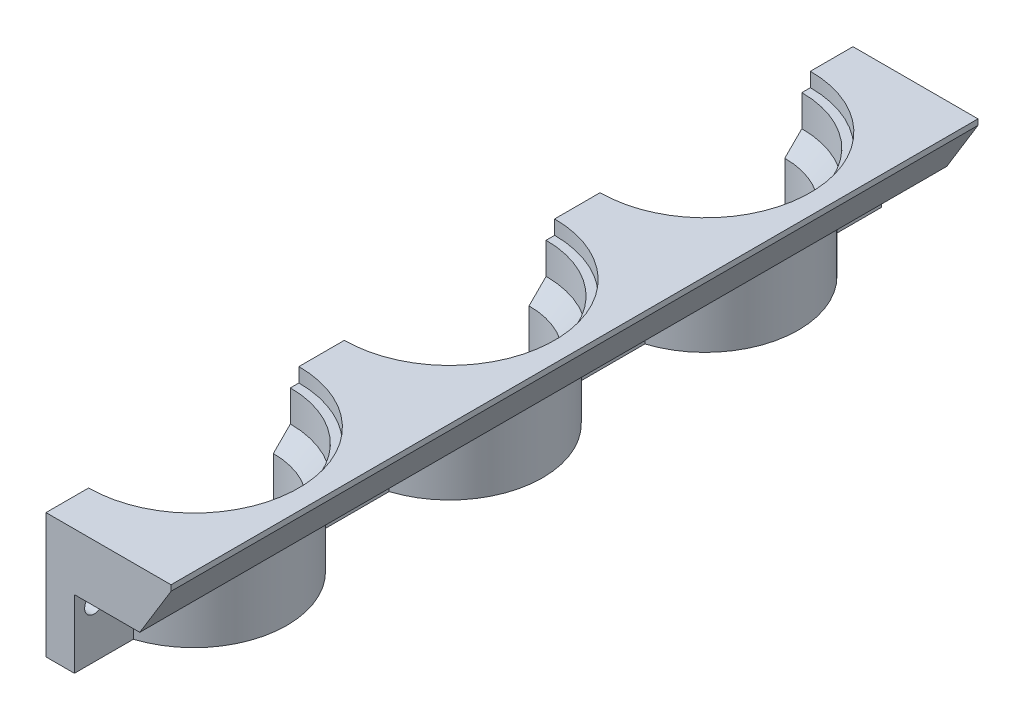
ISO-10303-21;
HEADER;
FILE_DESCRIPTION(('STEP AP214'),'2;1');
FILE_NAME('part.step','',(''),(''),'','','');
FILE_SCHEMA(('AUTOMOTIVE_DESIGN { 1 0 10303 214 1 1 1 1 }'));
ENDSEC;
DATA;
#1=APPLICATION_CONTEXT('core data for automotive mechanical design processes');
#2=APPLICATION_PROTOCOL_DEFINITION('international standard','automotive_design',2000,#1);
#3=PRODUCT_CONTEXT('',#1,'mechanical');
#4=PRODUCT('Part','Part','',(#3));
#5=PRODUCT_RELATED_PRODUCT_CATEGORY('part','',(#4));
#6=PRODUCT_DEFINITION_FORMATION('','',#4);
#7=PRODUCT_DEFINITION_CONTEXT('part definition',#1,'design');
#8=PRODUCT_DEFINITION('design','',#6,#7);
#9=PRODUCT_DEFINITION_SHAPE('','',#8);
#10=(LENGTH_UNIT() NAMED_UNIT(*) SI_UNIT(.MILLI.,.METRE.));
#11=(NAMED_UNIT(*) PLANE_ANGLE_UNIT() SI_UNIT($,.RADIAN.));
#12=(NAMED_UNIT(*) SI_UNIT($,.STERADIAN.) SOLID_ANGLE_UNIT());
#13=UNCERTAINTY_MEASURE_WITH_UNIT(LENGTH_MEASURE(1.E-05),#10,'distance_accuracy_value','');
#14=(GEOMETRIC_REPRESENTATION_CONTEXT(3) GLOBAL_UNCERTAINTY_ASSIGNED_CONTEXT((#13)) GLOBAL_UNIT_ASSIGNED_CONTEXT((#10,
#11,#12)) REPRESENTATION_CONTEXT('',''));
#15=CARTESIAN_POINT('',(0.,0.,0.));
#16=DIRECTION('',(0.,0.,1.));
#17=DIRECTION('',(1.,0.,0.));
#18=AXIS2_PLACEMENT_3D('',#15,#16,#17);
#19=CARTESIAN_POINT('',(0.,-10.,0.));
#20=DIRECTION('',(0.,1.,0.));
#21=DIRECTION('',(0.,0.,1.));
#22=AXIS2_PLACEMENT_3D('',#19,#20,#21);
#23=PLANE('',#22);
#24=DIRECTION('',(-1.,0.,0.));
#25=VECTOR('',#24,1.);
#26=CARTESIAN_POINT('',(0.,-10.,-116.));
#27=LINE('',#26,#25);
#28=CARTESIAN_POINT('',(16.5,-10.,-116.));
#29=VERTEX_POINT('',#28);
#30=CARTESIAN_POINT('',(5.00000000000001,-10.,-116.));
#31=VERTEX_POINT('',#30);
#32=EDGE_CURVE('E336',#29,#31,#27,.T.);
#33=ORIENTED_EDGE('',*,*,#32,.F.);
#34=DIRECTION('',(0.,0.,1.));
#35=VECTOR('',#34,1.);
#36=CARTESIAN_POINT('',(16.5,-10.,26.));
#37=LINE('',#36,#35);
#38=CARTESIAN_POINT('',(16.5,-10.,26.));
#39=VERTEX_POINT('',#38);
#40=EDGE_CURVE('E320',#29,#39,#37,.T.);
#41=ORIENTED_EDGE('',*,*,#40,.T.);
#42=DIRECTION('',(1.,0.,0.));
#43=VECTOR('',#42,1.);
#44=CARTESIAN_POINT('',(0.,-10.,26.));
#45=LINE('',#44,#43);
#46=CARTESIAN_POINT('',(5.00000000000001,-10.,26.));
#47=VERTEX_POINT('',#46);
#48=EDGE_CURVE('E348',#47,#39,#45,.T.);
#49=ORIENTED_EDGE('',*,*,#48,.F.);
#50=DIRECTION('',(0.,0.,1.));
#51=VECTOR('',#50,1.);
#52=CARTESIAN_POINT('',(5.,-10.,15.6192189305355));
#53=LINE('',#52,#51);
#54=CARTESIAN_POINT('',(5.,-10.,15.6192189305355));
#55=VERTEX_POINT('',#54);
#56=EDGE_CURVE('E410',#55,#47,#53,.T.);
#57=ORIENTED_EDGE('',*,*,#56,.F.);
#58=CARTESIAN_POINT('',(0.,-10.,0.));
#59=DIRECTION('',(0.,-1.,0.));
#60=DIRECTION('',(0.,0.,-1.));
#61=AXIS2_PLACEMENT_3D('',#58,#59,#60);
#62=CIRCLE('',#61,16.4);
#63=CARTESIAN_POINT('',(5.,-10.,-15.6192189305355));
#64=VERTEX_POINT('',#63);
#65=EDGE_CURVE('E415',#64,#55,#62,.T.);
#66=ORIENTED_EDGE('',*,*,#65,.F.);
#67=DIRECTION('',(0.,0.,1.));
#68=VECTOR('',#67,1.);
#69=CARTESIAN_POINT('',(5.,-10.,-29.3807810694645));
#70=LINE('',#69,#68);
#71=CARTESIAN_POINT('',(5.,-10.,-29.3807810694645));
#72=VERTEX_POINT('',#71);
#73=EDGE_CURVE('E419',#72,#64,#70,.T.);
#74=ORIENTED_EDGE('',*,*,#73,.F.);
#75=CARTESIAN_POINT('',(0.,-10.,-45.));
#76=DIRECTION('',(0.,-1.,0.));
#77=DIRECTION('',(0.,0.,-1.));
#78=AXIS2_PLACEMENT_3D('',#75,#76,#77);
#79=CIRCLE('',#78,16.4);
#80=CARTESIAN_POINT('',(5.,-10.,-60.6192189305355));
#81=VERTEX_POINT('',#80);
#82=EDGE_CURVE('E423',#81,#72,#79,.T.);
#83=ORIENTED_EDGE('',*,*,#82,.F.);
#84=DIRECTION('',(0.,0.,1.));
#85=VECTOR('',#84,1.);
#86=CARTESIAN_POINT('',(5.,-10.,-74.3807810694645));
#87=LINE('',#86,#85);
#88=CARTESIAN_POINT('',(5.,-10.,-74.3807810694645));
#89=VERTEX_POINT('',#88);
#90=EDGE_CURVE('E427',#89,#81,#87,.T.);
#91=ORIENTED_EDGE('',*,*,#90,.F.);
#92=CARTESIAN_POINT('',(0.,-10.,-90.));
#93=DIRECTION('',(0.,-1.,0.));
#94=DIRECTION('',(0.,0.,-1.));
#95=AXIS2_PLACEMENT_3D('',#92,#93,#94);
#96=CIRCLE('',#95,16.4);
#97=CARTESIAN_POINT('',(5.,-10.,-105.619218930536));
#98=VERTEX_POINT('',#97);
#99=EDGE_CURVE('E431',#98,#89,#96,.T.);
#100=ORIENTED_EDGE('',*,*,#99,.F.);
#101=DIRECTION('',(0.,0.,1.));
#102=VECTOR('',#101,1.);
#103=CARTESIAN_POINT('',(5.00000000000001,-10.,-116.));
#104=LINE('',#103,#102);
#105=EDGE_CURVE('E435',#31,#98,#104,.T.);
#106=ORIENTED_EDGE('',*,*,#105,.F.);
#107=EDGE_LOOP('',(#33,#41,#49,#57,#66,#74,#83,#91,#100,#106));
#108=FACE_BOUND('',#107,.T.);
#109=ADVANCED_FACE('F49',(#108),#23,.F.);
#110=CARTESIAN_POINT('',(0.,-10.,-11.4));
#111=DIRECTION('',(-1.,0.,0.));
#112=DIRECTION('',(0.,0.,1.));
#113=AXIS2_PLACEMENT_3D('',#110,#111,#112);
#114=PLANE('',#113);
#115=CARTESIAN_POINT('',(0.,-13.,-22.5));
#116=DIRECTION('',(-1.,0.,0.));
#117=DIRECTION('',(0.,0.,1.));
#118=AXIS2_PLACEMENT_3D('',#115,#116,#117);
#119=CIRCLE('',#118,1.7);
#120=CARTESIAN_POINT('',(0.,-13.,-20.8));
#121=VERTEX_POINT('',#120);
#122=EDGE_CURVE('E593',#121,#121,#119,.T.);
#123=ORIENTED_EDGE('',*,*,#122,.F.);
#124=EDGE_LOOP('',(#123));
#125=FACE_BOUND('',#124,.T.);
#126=DIRECTION('',(0.,1.,0.));
#127=VECTOR('',#126,1.);
#128=CARTESIAN_POINT('',(0.,0.,-14.));
#129=LINE('',#128,#127);
#130=CARTESIAN_POINT('',(0.,-11.,-14.));
#131=VERTEX_POINT('',#130);
#132=CARTESIAN_POINT('',(0.,-22.,-14.));
#133=VERTEX_POINT('',#132);
#134=EDGE_CURVE('E66',#131,#133,#129,.F.);
#135=ORIENTED_EDGE('',*,*,#134,.F.);
#136=DIRECTION('',(0.,-0.707106781186549,0.707106781186546));
#137=VECTOR('',#136,1.);
#138=CARTESIAN_POINT('',(0.,-25.,0.));
#139=LINE('',#138,#137);
#140=CARTESIAN_POINT('',(0.,-8.,-17.));
#141=VERTEX_POINT('',#140);
#142=EDGE_CURVE('E271',#141,#131,#139,.T.);
#143=ORIENTED_EDGE('',*,*,#142,.F.);
#144=DIRECTION('',(0.,1.,0.));
#145=VECTOR('',#144,1.);
#146=CARTESIAN_POINT('',(0.,0.,-17.));
#147=LINE('',#146,#145);
#148=CARTESIAN_POINT('',(0.,-2.5,-17.));
#149=VERTEX_POINT('',#148);
#150=EDGE_CURVE('E549',#149,#141,#147,.F.);
#151=ORIENTED_EDGE('',*,*,#150,.F.);
#152=DIRECTION('',(0.,0.,-1.));
#153=VECTOR('',#152,1.);
#154=CARTESIAN_POINT('',(0.,-2.5,-11.4));
#155=LINE('',#154,#153);
#156=CARTESIAN_POINT('',(0.,-2.5,-18.5));
#157=VERTEX_POINT('',#156);
#158=EDGE_CURVE('E563',#149,#157,#155,.T.);
#159=ORIENTED_EDGE('',*,*,#158,.T.);
#160=DIRECTION('',(0.,1.,0.));
#161=VECTOR('',#160,1.);
#162=CARTESIAN_POINT('',(0.,0.,-18.5));
#163=LINE('',#162,#161);
#164=CARTESIAN_POINT('',(0.,0.,-18.5));
#165=VERTEX_POINT('',#164);
#166=EDGE_CURVE('E567',#165,#157,#163,.F.);
#167=ORIENTED_EDGE('',*,*,#166,.F.);
#168=DIRECTION('',(0.,0.,1.));
#169=VECTOR('',#168,1.);
#170=CARTESIAN_POINT('',(0.,0.,-11.4));
#171=LINE('',#170,#169);
#172=CARTESIAN_POINT('',(0.,0.,-26.5));
#173=VERTEX_POINT('',#172);
#174=EDGE_CURVE('E344',#173,#165,#171,.T.);
#175=ORIENTED_EDGE('',*,*,#174,.F.);
#176=DIRECTION('',(0.,1.,0.));
#177=VECTOR('',#176,1.);
#178=CARTESIAN_POINT('',(0.,0.,-26.5));
#179=LINE('',#178,#177);
#180=CARTESIAN_POINT('',(0.,-2.5,-26.5));
#181=VERTEX_POINT('',#180);
#182=EDGE_CURVE('E529',#181,#173,#179,.T.);
#183=ORIENTED_EDGE('',*,*,#182,.F.);
#184=DIRECTION('',(0.,0.,-1.));
#185=VECTOR('',#184,1.);
#186=CARTESIAN_POINT('',(0.,-2.5,-11.4));
#187=LINE('',#186,#185);
#188=CARTESIAN_POINT('',(0.,-2.5,-28.));
#189=VERTEX_POINT('',#188);
#190=EDGE_CURVE('E525',#181,#189,#187,.T.);
#191=ORIENTED_EDGE('',*,*,#190,.T.);
#192=DIRECTION('',(0.,1.,0.));
#193=VECTOR('',#192,1.);
#194=CARTESIAN_POINT('',(0.,0.,-28.));
#195=LINE('',#194,#193);
#196=CARTESIAN_POINT('',(0.,-8.,-28.));
#197=VERTEX_POINT('',#196);
#198=EDGE_CURVE('E509',#197,#189,#195,.T.);
#199=ORIENTED_EDGE('',*,*,#198,.F.);
#200=DIRECTION('',(0.,0.707106781186549,0.707106781186546));
#201=VECTOR('',#200,1.);
#202=CARTESIAN_POINT('',(0.,-25.,-45.));
#203=LINE('',#202,#201);
#204=CARTESIAN_POINT('',(0.,-11.,-31.));
#205=VERTEX_POINT('',#204);
#206=EDGE_CURVE('E522',#205,#197,#203,.T.);
#207=ORIENTED_EDGE('',*,*,#206,.F.);
#208=DIRECTION('',(0.,1.,0.));
#209=VECTOR('',#208,1.);
#210=CARTESIAN_POINT('',(0.,0.,-31.));
#211=LINE('',#210,#209);
#212=CARTESIAN_POINT('',(0.,-22.,-31.));
#213=VERTEX_POINT('',#212);
#214=EDGE_CURVE('E535',#213,#205,#211,.T.);
#215=ORIENTED_EDGE('',*,*,#214,.F.);
#216=DIRECTION('',(0.,0.,-1.));
#217=VECTOR('',#216,1.);
#218=CARTESIAN_POINT('',(0.,-22.,-33.6));
#219=LINE('',#218,#217);
#220=EDGE_CURVE('E445',#133,#213,#219,.T.);
#221=ORIENTED_EDGE('',*,*,#220,.F.);
#222=EDGE_LOOP('',(#135,#143,#151,#159,#167,#175,#183,#191,#199,#207,#215,#221));
#223=FACE_BOUND('',#222,.T.);
#224=ADVANCED_FACE('F690',(#125,#223),#114,.T.);
#225=CARTESIAN_POINT('',(0.,-10.,-56.4));
#226=DIRECTION('',(-1.,0.,0.));
#227=DIRECTION('',(0.,0.,1.));
#228=AXIS2_PLACEMENT_3D('',#225,#226,#227);
#229=PLANE('',#228);
#230=CARTESIAN_POINT('',(0.,-13.,-67.5));
#231=DIRECTION('',(-1.,0.,0.));
#232=DIRECTION('',(0.,0.,1.));
#233=AXIS2_PLACEMENT_3D('',#230,#231,#232);
#234=CIRCLE('',#233,1.7);
#235=CARTESIAN_POINT('',(0.,-13.,-65.8));
#236=VERTEX_POINT('',#235);
#237=EDGE_CURVE('E581',#236,#236,#234,.T.);
#238=ORIENTED_EDGE('',*,*,#237,.F.);
#239=EDGE_LOOP('',(#238));
#240=FACE_BOUND('',#239,.T.);
#241=DIRECTION('',(0.,1.,0.));
#242=VECTOR('',#241,1.);
#243=CARTESIAN_POINT('',(0.,0.,-59.));
#244=LINE('',#243,#242);
#245=CARTESIAN_POINT('',(0.,-11.,-59.));
#246=VERTEX_POINT('',#245);
#247=CARTESIAN_POINT('',(0.,-22.,-59.));
#248=VERTEX_POINT('',#247);
#249=EDGE_CURVE('E74',#246,#248,#244,.F.);
#250=ORIENTED_EDGE('',*,*,#249,.F.);
#251=DIRECTION('',(0.,-0.707106781186549,0.707106781186546));
#252=VECTOR('',#251,1.);
#253=CARTESIAN_POINT('',(0.,-25.,-45.));
#254=LINE('',#253,#252);
#255=CARTESIAN_POINT('',(0.,-8.,-62.));
#256=VERTEX_POINT('',#255);
#257=EDGE_CURVE('E290',#256,#246,#254,.T.);
#258=ORIENTED_EDGE('',*,*,#257,.F.);
#259=DIRECTION('',(0.,1.,0.));
#260=VECTOR('',#259,1.);
#261=CARTESIAN_POINT('',(0.,0.,-62.));
#262=LINE('',#261,#260);
#263=CARTESIAN_POINT('',(0.,-2.5,-62.));
#264=VERTEX_POINT('',#263);
#265=EDGE_CURVE('E293',#264,#256,#262,.F.);
#266=ORIENTED_EDGE('',*,*,#265,.F.);
#267=DIRECTION('',(0.,0.,-1.));
#268=VECTOR('',#267,1.);
#269=CARTESIAN_POINT('',(0.,-2.5,-56.4));
#270=LINE('',#269,#268);
#271=CARTESIAN_POINT('',(0.,-2.5,-63.5));
#272=VERTEX_POINT('',#271);
#273=EDGE_CURVE('E296',#264,#272,#270,.T.);
#274=ORIENTED_EDGE('',*,*,#273,.T.);
#275=DIRECTION('',(0.,1.,0.));
#276=VECTOR('',#275,1.);
#277=CARTESIAN_POINT('',(0.,0.,-63.5));
#278=LINE('',#277,#276);
#279=CARTESIAN_POINT('',(0.,0.,-63.5));
#280=VERTEX_POINT('',#279);
#281=EDGE_CURVE('E532',#280,#272,#278,.F.);
#282=ORIENTED_EDGE('',*,*,#281,.F.);
#283=DIRECTION('',(0.,0.,1.));
#284=VECTOR('',#283,1.);
#285=CARTESIAN_POINT('',(0.,0.,-56.4));
#286=LINE('',#285,#284);
#287=CARTESIAN_POINT('',(0.,0.,-71.5));
#288=VERTEX_POINT('',#287);
#289=EDGE_CURVE('E349',#288,#280,#286,.T.);
#290=ORIENTED_EDGE('',*,*,#289,.F.);
#291=DIRECTION('',(0.,1.,0.));
#292=VECTOR('',#291,1.);
#293=CARTESIAN_POINT('',(0.,0.,-71.5));
#294=LINE('',#293,#292);
#295=CARTESIAN_POINT('',(0.,-2.5,-71.5));
#296=VERTEX_POINT('',#295);
#297=EDGE_CURVE('E488',#296,#288,#294,.T.);
#298=ORIENTED_EDGE('',*,*,#297,.F.);
#299=DIRECTION('',(0.,0.,-1.));
#300=VECTOR('',#299,1.);
#301=CARTESIAN_POINT('',(0.,-2.5,-56.4));
#302=LINE('',#301,#300);
#303=CARTESIAN_POINT('',(0.,-2.5,-73.));
#304=VERTEX_POINT('',#303);
#305=EDGE_CURVE('E484',#296,#304,#302,.T.);
#306=ORIENTED_EDGE('',*,*,#305,.T.);
#307=DIRECTION('',(0.,1.,0.));
#308=VECTOR('',#307,1.);
#309=CARTESIAN_POINT('',(0.,0.,-73.));
#310=LINE('',#309,#308);
#311=CARTESIAN_POINT('',(0.,-8.,-73.));
#312=VERTEX_POINT('',#311);
#313=EDGE_CURVE('E439',#312,#304,#310,.T.);
#314=ORIENTED_EDGE('',*,*,#313,.F.);
#315=DIRECTION('',(0.,0.707106781186549,0.707106781186546));
#316=VECTOR('',#315,1.);
#317=CARTESIAN_POINT('',(0.,-25.,-90.));
#318=LINE('',#317,#316);
#319=CARTESIAN_POINT('',(0.,-11.,-76.));
#320=VERTEX_POINT('',#319);
#321=EDGE_CURVE('E481',#320,#312,#318,.T.);
#322=ORIENTED_EDGE('',*,*,#321,.F.);
#323=DIRECTION('',(0.,1.,0.));
#324=VECTOR('',#323,1.);
#325=CARTESIAN_POINT('',(0.,0.,-76.));
#326=LINE('',#325,#324);
#327=CARTESIAN_POINT('',(0.,-22.,-76.));
#328=VERTEX_POINT('',#327);
#329=EDGE_CURVE('E494',#328,#320,#326,.T.);
#330=ORIENTED_EDGE('',*,*,#329,.F.);
#331=DIRECTION('',(0.,0.,-1.));
#332=VECTOR('',#331,1.);
#333=CARTESIAN_POINT('',(0.,-22.,-78.6));
#334=LINE('',#333,#332);
#335=EDGE_CURVE('E442',#248,#328,#334,.T.);
#336=ORIENTED_EDGE('',*,*,#335,.F.);
#337=EDGE_LOOP('',(#250,#258,#266,#274,#282,#290,#298,#306,#314,#322,#330,#336));
#338=FACE_BOUND('',#337,.T.);
#339=ADVANCED_FACE('F695',(#240,#338),#229,.T.);
#340=CARTESIAN_POINT('',(0.,-10.,-101.4));
#341=DIRECTION('',(-1.,0.,0.));
#342=DIRECTION('',(0.,0.,1.));
#343=AXIS2_PLACEMENT_3D('',#340,#341,#342);
#344=PLANE('',#343);
#345=CARTESIAN_POINT('',(0.,-13.,-112.5));
#346=DIRECTION('',(-1.,0.,0.));
#347=DIRECTION('',(0.,0.,1.));
#348=AXIS2_PLACEMENT_3D('',#345,#346,#347);
#349=CIRCLE('',#348,1.7);
#350=CARTESIAN_POINT('',(0.,-13.,-110.8));
#351=VERTEX_POINT('',#350);
#352=EDGE_CURVE('E606',#351,#351,#349,.T.);
#353=ORIENTED_EDGE('',*,*,#352,.F.);
#354=EDGE_LOOP('',(#353));
#355=FACE_BOUND('',#354,.T.);
#356=DIRECTION('',(0.,1.,0.));
#357=VECTOR('',#356,1.);
#358=CARTESIAN_POINT('',(0.,0.,-104.));
#359=LINE('',#358,#357);
#360=CARTESIAN_POINT('',(0.,-11.,-104.));
#361=VERTEX_POINT('',#360);
#362=CARTESIAN_POINT('',(0.,-22.,-104.));
#363=VERTEX_POINT('',#362);
#364=EDGE_CURVE('E497',#361,#363,#359,.F.);
#365=ORIENTED_EDGE('',*,*,#364,.F.);
#366=DIRECTION('',(0.,-0.707106781186549,0.707106781186546));
#367=VECTOR('',#366,1.);
#368=CARTESIAN_POINT('',(0.,-25.,-90.));
#369=LINE('',#368,#367);
#370=CARTESIAN_POINT('',(0.,-8.,-107.));
#371=VERTEX_POINT('',#370);
#372=EDGE_CURVE('E303',#371,#361,#369,.T.);
#373=ORIENTED_EDGE('',*,*,#372,.F.);
#374=DIRECTION('',(0.,1.,0.));
#375=VECTOR('',#374,1.);
#376=CARTESIAN_POINT('',(0.,0.,-107.));
#377=LINE('',#376,#375);
#378=CARTESIAN_POINT('',(0.,-2.5,-107.));
#379=VERTEX_POINT('',#378);
#380=EDGE_CURVE('E306',#379,#371,#377,.F.);
#381=ORIENTED_EDGE('',*,*,#380,.F.);
#382=DIRECTION('',(0.,0.,-1.));
#383=VECTOR('',#382,1.);
#384=CARTESIAN_POINT('',(0.,-2.5,-101.4));
#385=LINE('',#384,#383);
#386=CARTESIAN_POINT('',(0.,-2.5,-108.5));
#387=VERTEX_POINT('',#386);
#388=EDGE_CURVE('E309',#379,#387,#385,.T.);
#389=ORIENTED_EDGE('',*,*,#388,.T.);
#390=DIRECTION('',(0.,1.,0.));
#391=VECTOR('',#390,1.);
#392=CARTESIAN_POINT('',(0.,0.,-108.5));
#393=LINE('',#392,#391);
#394=CARTESIAN_POINT('',(0.,0.,-108.5));
#395=VERTEX_POINT('',#394);
#396=EDGE_CURVE('E491',#395,#387,#393,.F.);
#397=ORIENTED_EDGE('',*,*,#396,.F.);
#398=DIRECTION('',(0.,0.,1.));
#399=VECTOR('',#398,1.);
#400=CARTESIAN_POINT('',(0.,0.,-101.4));
#401=LINE('',#400,#399);
#402=CARTESIAN_POINT('',(0.,0.,-116.));
#403=VERTEX_POINT('',#402);
#404=EDGE_CURVE('E353',#403,#395,#401,.T.);
#405=ORIENTED_EDGE('',*,*,#404,.F.);
#406=DIRECTION('',(0.,1.,0.));
#407=VECTOR('',#406,1.);
#408=CARTESIAN_POINT('',(0.,-10.,-116.));
#409=LINE('',#408,#407);
#410=CARTESIAN_POINT('',(0.,-22.,-116.));
#411=VERTEX_POINT('',#410);
#412=EDGE_CURVE('E330',#411,#403,#409,.T.);
#413=ORIENTED_EDGE('',*,*,#412,.F.);
#414=DIRECTION('',(0.,0.,-1.));
#415=VECTOR('',#414,1.);
#416=CARTESIAN_POINT('',(0.,-22.,-116.));
#417=LINE('',#416,#415);
#418=EDGE_CURVE('E409',#363,#411,#417,.T.);
#419=ORIENTED_EDGE('',*,*,#418,.F.);
#420=EDGE_LOOP('',(#365,#373,#381,#389,#397,#405,#413,#419));
#421=FACE_BOUND('',#420,.T.);
#422=ADVANCED_FACE('F703',(#355,#421),#344,.T.);
#423=CARTESIAN_POINT('',(0.,-10.,-116.));
#424=DIRECTION('',(0.,0.,-1.));
#425=DIRECTION('',(-1.,0.,0.));
#426=AXIS2_PLACEMENT_3D('',#423,#424,#425);
#427=PLANE('',#426);
#428=DIRECTION('',(0.,1.,0.));
#429=VECTOR('',#428,1.);
#430=CARTESIAN_POINT('',(22.,-10.,-116.));
#431=LINE('',#430,#429);
#432=CARTESIAN_POINT('',(22.,-0.999999999999964,-116.));
#433=VERTEX_POINT('',#432);
#434=CARTESIAN_POINT('',(22.,0.,-116.));
#435=VERTEX_POINT('',#434);
#436=EDGE_CURVE('E339',#433,#435,#431,.T.);
#437=ORIENTED_EDGE('',*,*,#436,.F.);
#438=DIRECTION('',(-0.521450009453974,-0.85328183365196,0.));
#439=VECTOR('',#438,1.);
#440=CARTESIAN_POINT('',(12.0134831460674,-17.3415730337079,-116.));
#441=LINE('',#440,#439);
#442=EDGE_CURVE('E323',#433,#29,#441,.T.);
#443=ORIENTED_EDGE('',*,*,#442,.T.);
#444=ORIENTED_EDGE('',*,*,#32,.T.);
#445=DIRECTION('',(0.,1.,0.));
#446=VECTOR('',#445,1.);
#447=CARTESIAN_POINT('',(5.00000000000001,-22.,-116.));
#448=LINE('',#447,#446);
#449=CARTESIAN_POINT('',(5.00000000000001,-22.,-116.));
#450=VERTEX_POINT('',#449);
#451=EDGE_CURVE('E372',#450,#31,#448,.T.);
#452=ORIENTED_EDGE('',*,*,#451,.F.);
#453=DIRECTION('',(1.,0.,0.));
#454=VECTOR('',#453,1.);
#455=CARTESIAN_POINT('',(0.,-22.,-116.));
#456=LINE('',#455,#454);
#457=EDGE_CURVE('E414',#411,#450,#456,.T.);
#458=ORIENTED_EDGE('',*,*,#457,.F.);
#459=ORIENTED_EDGE('',*,*,#412,.T.);
#460=DIRECTION('',(-1.,0.,0.));
#461=VECTOR('',#460,1.);
#462=CARTESIAN_POINT('',(0.,0.,-116.));
#463=LINE('',#462,#461);
#464=EDGE_CURVE('E357',#435,#403,#463,.T.);
#465=ORIENTED_EDGE('',*,*,#464,.F.);
#466=EDGE_LOOP('',(#437,#443,#444,#452,#458,#459,#465));
#467=FACE_BOUND('',#466,.T.);
#468=ADVANCED_FACE('F644',(#467),#427,.T.);
#469=CARTESIAN_POINT('',(22.,-10.,26.));
#470=DIRECTION('',(1.,0.,0.));
#471=DIRECTION('',(0.,0.,-1.));
#472=AXIS2_PLACEMENT_3D('',#469,#470,#471);
#473=PLANE('',#472);
#474=DIRECTION('',(0.,1.,0.));
#475=VECTOR('',#474,1.);
#476=CARTESIAN_POINT('',(22.,-10.,26.));
#477=LINE('',#476,#475);
#478=CARTESIAN_POINT('',(22.,-0.999999999999964,26.));
#479=VERTEX_POINT('',#478);
#480=CARTESIAN_POINT('',(22.,0.,26.));
#481=VERTEX_POINT('',#480);
#482=EDGE_CURVE('E335',#479,#481,#477,.T.);
#483=ORIENTED_EDGE('',*,*,#482,.F.);
#484=DIRECTION('',(0.,0.,-1.));
#485=VECTOR('',#484,1.);
#486=CARTESIAN_POINT('',(22.,-0.999999999999964,-116.));
#487=LINE('',#486,#485);
#488=EDGE_CURVE('E326',#479,#433,#487,.T.);
#489=ORIENTED_EDGE('',*,*,#488,.T.);
#490=ORIENTED_EDGE('',*,*,#436,.T.);
#491=DIRECTION('',(0.,0.,-1.));
#492=VECTOR('',#491,1.);
#493=CARTESIAN_POINT('',(22.,0.,26.));
#494=LINE('',#493,#492);
#495=EDGE_CURVE('E361',#481,#435,#494,.T.);
#496=ORIENTED_EDGE('',*,*,#495,.F.);
#497=EDGE_LOOP('',(#483,#489,#490,#496));
#498=FACE_BOUND('',#497,.T.);
#499=ADVANCED_FACE('F655',(#498),#473,.T.);
#500=CARTESIAN_POINT('',(0.,-10.,26.));
#501=DIRECTION('',(0.,0.,1.));
#502=DIRECTION('',(1.,0.,0.));
#503=AXIS2_PLACEMENT_3D('',#500,#501,#502);
#504=PLANE('',#503);
#505=ORIENTED_EDGE('',*,*,#48,.T.);
#506=DIRECTION('',(0.521450009453974,0.85328183365196,0.));
#507=VECTOR('',#506,1.);
#508=CARTESIAN_POINT('',(12.0134831460674,-17.3415730337079,26.));
#509=LINE('',#508,#507);
#510=EDGE_CURVE('E317',#39,#479,#509,.T.);
#511=ORIENTED_EDGE('',*,*,#510,.T.);
#512=ORIENTED_EDGE('',*,*,#482,.T.);
#513=DIRECTION('',(1.,0.,0.));
#514=VECTOR('',#513,1.);
#515=CARTESIAN_POINT('',(0.,0.,26.));
#516=LINE('',#515,#514);
#517=CARTESIAN_POINT('',(0.,0.,26.));
#518=VERTEX_POINT('',#517);
#519=EDGE_CURVE('E365',#518,#481,#516,.T.);
#520=ORIENTED_EDGE('',*,*,#519,.F.);
#521=DIRECTION('',(0.,1.,0.));
#522=VECTOR('',#521,1.);
#523=CARTESIAN_POINT('',(0.,-10.,26.));
#524=LINE('',#523,#522);
#525=CARTESIAN_POINT('',(0.,-22.,26.));
#526=VERTEX_POINT('',#525);
#527=EDGE_CURVE('E331',#526,#518,#524,.T.);
#528=ORIENTED_EDGE('',*,*,#527,.F.);
#529=DIRECTION('',(-1.,0.,0.));
#530=VECTOR('',#529,1.);
#531=CARTESIAN_POINT('',(0.,-22.,26.));
#532=LINE('',#531,#530);
#533=CARTESIAN_POINT('',(5.00000000000001,-22.,26.));
#534=VERTEX_POINT('',#533);
#535=EDGE_CURVE('E451',#534,#526,#532,.T.);
#536=ORIENTED_EDGE('',*,*,#535,.F.);
#537=DIRECTION('',(0.,1.,0.));
#538=VECTOR('',#537,1.);
#539=CARTESIAN_POINT('',(5.00000000000001,-22.,26.));
#540=LINE('',#539,#538);
#541=EDGE_CURVE('E405',#534,#47,#540,.T.);
#542=ORIENTED_EDGE('',*,*,#541,.T.);
#543=EDGE_LOOP('',(#505,#511,#512,#520,#528,#536,#542));
#544=FACE_BOUND('',#543,.T.);
#545=ADVANCED_FACE('F651',(#544),#504,.T.);
#546=CARTESIAN_POINT('',(0.,-10.,11.4));
#547=DIRECTION('',(-1.,0.,0.));
#548=DIRECTION('',(0.,0.,1.));
#549=AXIS2_PLACEMENT_3D('',#546,#547,#548);
#550=PLANE('',#549);
#551=CARTESIAN_POINT('',(0.,-13.,22.5));
#552=DIRECTION('',(-1.,0.,0.));
#553=DIRECTION('',(0.,0.,1.));
#554=AXIS2_PLACEMENT_3D('',#551,#552,#553);
#555=CIRCLE('',#554,1.7);
#556=CARTESIAN_POINT('',(0.,-13.,24.2));
#557=VERTEX_POINT('',#556);
#558=EDGE_CURVE('E597',#557,#557,#555,.T.);
#559=ORIENTED_EDGE('',*,*,#558,.F.);
#560=EDGE_LOOP('',(#559));
#561=FACE_BOUND('',#560,.T.);
#562=DIRECTION('',(0.,1.,0.));
#563=VECTOR('',#562,1.);
#564=CARTESIAN_POINT('',(0.,0.,14.));
#565=LINE('',#564,#563);
#566=CARTESIAN_POINT('',(0.,-22.,14.));
#567=VERTEX_POINT('',#566);
#568=CARTESIAN_POINT('',(0.,-11.,14.));
#569=VERTEX_POINT('',#568);
#570=EDGE_CURVE('E254',#567,#569,#565,.T.);
#571=ORIENTED_EDGE('',*,*,#570,.F.);
#572=DIRECTION('',(0.,0.,-1.));
#573=VECTOR('',#572,1.);
#574=CARTESIAN_POINT('',(0.,-22.,11.4));
#575=LINE('',#574,#573);
#576=EDGE_CURVE('E448',#526,#567,#575,.T.);
#577=ORIENTED_EDGE('',*,*,#576,.F.);
#578=ORIENTED_EDGE('',*,*,#527,.T.);
#579=DIRECTION('',(0.,0.,1.));
#580=VECTOR('',#579,1.);
#581=CARTESIAN_POINT('',(0.,0.,11.4));
#582=LINE('',#581,#580);
#583=CARTESIAN_POINT('',(0.,0.,18.5));
#584=VERTEX_POINT('',#583);
#585=EDGE_CURVE('E369',#584,#518,#582,.T.);
#586=ORIENTED_EDGE('',*,*,#585,.F.);
#587=DIRECTION('',(0.,1.,0.));
#588=VECTOR('',#587,1.);
#589=CARTESIAN_POINT('',(0.,0.,18.5));
#590=LINE('',#589,#588);
#591=CARTESIAN_POINT('',(0.,-2.5,18.5));
#592=VERTEX_POINT('',#591);
#593=EDGE_CURVE('E570',#592,#584,#590,.T.);
#594=ORIENTED_EDGE('',*,*,#593,.F.);
#595=DIRECTION('',(0.,0.,-1.));
#596=VECTOR('',#595,1.);
#597=CARTESIAN_POINT('',(0.,-2.5,11.4));
#598=LINE('',#597,#596);
#599=CARTESIAN_POINT('',(0.,-2.5,17.));
#600=VERTEX_POINT('',#599);
#601=EDGE_CURVE('E280',#592,#600,#598,.T.);
#602=ORIENTED_EDGE('',*,*,#601,.T.);
#603=DIRECTION('',(0.,1.,0.));
#604=VECTOR('',#603,1.);
#605=CARTESIAN_POINT('',(0.,0.,17.));
#606=LINE('',#605,#604);
#607=CARTESIAN_POINT('',(0.,-8.,17.));
#608=VERTEX_POINT('',#607);
#609=EDGE_CURVE('E59',#608,#600,#606,.T.);
#610=ORIENTED_EDGE('',*,*,#609,.F.);
#611=DIRECTION('',(0.,0.707106781186549,0.707106781186546));
#612=VECTOR('',#611,1.);
#613=CARTESIAN_POINT('',(0.,-25.,0.));
#614=LINE('',#613,#612);
#615=EDGE_CURVE('E11',#569,#608,#614,.T.);
#616=ORIENTED_EDGE('',*,*,#615,.F.);
#617=EDGE_LOOP('',(#571,#577,#578,#586,#594,#602,#610,#616));
#618=FACE_BOUND('',#617,.T.);
#619=ADVANCED_FACE('F277',(#561,#618),#550,.T.);
#620=CARTESIAN_POINT('',(0.,0.,0.));
#621=DIRECTION('',(0.,1.,0.));
#622=DIRECTION('',(0.,0.,1.));
#623=AXIS2_PLACEMENT_3D('',#620,#621,#622);
#624=PLANE('',#623);
#625=CARTESIAN_POINT('',(0.,0.,0.));
#626=DIRECTION('',(0.,1.,0.));
#627=DIRECTION('',(0.,0.,1.));
#628=AXIS2_PLACEMENT_3D('',#625,#626,#627);
#629=CIRCLE('',#628,18.5);
#630=EDGE_CURVE('E274',#584,#165,#629,.T.);
#631=ORIENTED_EDGE('',*,*,#630,.F.);
#632=ORIENTED_EDGE('',*,*,#585,.T.);
#633=ORIENTED_EDGE('',*,*,#519,.T.);
#634=ORIENTED_EDGE('',*,*,#495,.T.);
#635=ORIENTED_EDGE('',*,*,#464,.T.);
#636=ORIENTED_EDGE('',*,*,#404,.T.);
#637=CARTESIAN_POINT('',(0.,0.,-90.));
#638=DIRECTION('',(0.,1.,0.));
#639=DIRECTION('',(0.,0.,1.));
#640=AXIS2_PLACEMENT_3D('',#637,#638,#639);
#641=CIRCLE('',#640,18.5);
#642=EDGE_CURVE('E501',#288,#395,#641,.T.);
#643=ORIENTED_EDGE('',*,*,#642,.F.);
#644=ORIENTED_EDGE('',*,*,#289,.T.);
#645=CARTESIAN_POINT('',(0.,0.,-45.));
#646=DIRECTION('',(0.,1.,0.));
#647=DIRECTION('',(0.,0.,1.));
#648=AXIS2_PLACEMENT_3D('',#645,#646,#647);
#649=CIRCLE('',#648,18.5);
#650=EDGE_CURVE('E541',#173,#280,#649,.T.);
#651=ORIENTED_EDGE('',*,*,#650,.F.);
#652=ORIENTED_EDGE('',*,*,#174,.T.);
#653=EDGE_LOOP('',(#631,#632,#633,#634,#635,#636,#643,#644,#651,#652));
#654=FACE_BOUND('',#653,.T.);
#655=ADVANCED_FACE('F624',(#654),#624,.T.);
#656=CARTESIAN_POINT('',(5.00000000000001,-22.,-116.));
#657=DIRECTION('',(-1.,0.,0.));
#658=DIRECTION('',(0.,0.,1.));
#659=AXIS2_PLACEMENT_3D('',#656,#657,#658);
#660=PLANE('',#659);
#661=CARTESIAN_POINT('',(5.,-13.,-112.5));
#662=DIRECTION('',(1.,0.,0.));
#663=DIRECTION('',(0.,0.,-1.));
#664=AXIS2_PLACEMENT_3D('',#661,#662,#663);
#665=CIRCLE('',#664,1.7);
#666=CARTESIAN_POINT('',(5.,-13.,-114.2));
#667=VERTEX_POINT('',#666);
#668=EDGE_CURVE('E613',#667,#667,#665,.T.);
#669=ORIENTED_EDGE('',*,*,#668,.F.);
#670=EDGE_LOOP('',(#669));
#671=FACE_BOUND('',#670,.T.);
#672=ORIENTED_EDGE('',*,*,#105,.T.);
#673=DIRECTION('',(0.,1.,0.));
#674=VECTOR('',#673,1.);
#675=CARTESIAN_POINT('',(5.,-22.,-105.619218930536));
#676=LINE('',#675,#674);
#677=CARTESIAN_POINT('',(5.,-22.,-105.619218930536));
#678=VERTEX_POINT('',#677);
#679=EDGE_CURVE('E381',#678,#98,#676,.T.);
#680=ORIENTED_EDGE('',*,*,#679,.F.);
#681=DIRECTION('',(0.,0.,1.));
#682=VECTOR('',#681,1.);
#683=CARTESIAN_POINT('',(5.00000000000001,-22.,-116.));
#684=LINE('',#683,#682);
#685=EDGE_CURVE('E473',#450,#678,#684,.T.);
#686=ORIENTED_EDGE('',*,*,#685,.F.);
#687=ORIENTED_EDGE('',*,*,#451,.T.);
#688=EDGE_LOOP('',(#672,#680,#686,#687));
#689=FACE_BOUND('',#688,.T.);
#690=ADVANCED_FACE('F620',(#671,#689),#660,.F.);
#691=CARTESIAN_POINT('',(0.,-22.,-90.));
#692=DIRECTION('',(0.,1.,0.));
#693=DIRECTION('',(0.,0.,1.));
#694=AXIS2_PLACEMENT_3D('',#691,#692,#693);
#695=CYLINDRICAL_SURFACE('',#694,16.4);
#696=ORIENTED_EDGE('',*,*,#99,.T.);
#697=DIRECTION('',(0.,1.,0.));
#698=VECTOR('',#697,1.);
#699=CARTESIAN_POINT('',(5.,-22.,-74.3807810694645));
#700=LINE('',#699,#698);
#701=CARTESIAN_POINT('',(5.,-22.,-74.3807810694645));
#702=VERTEX_POINT('',#701);
#703=EDGE_CURVE('E385',#702,#89,#700,.T.);
#704=ORIENTED_EDGE('',*,*,#703,.F.);
#705=CARTESIAN_POINT('',(0.,-22.,-90.));
#706=DIRECTION('',(0.,-1.,0.));
#707=DIRECTION('',(0.,0.,-1.));
#708=AXIS2_PLACEMENT_3D('',#705,#706,#707);
#709=CIRCLE('',#708,16.4);
#710=EDGE_CURVE('E470',#678,#702,#709,.T.);
#711=ORIENTED_EDGE('',*,*,#710,.F.);
#712=ORIENTED_EDGE('',*,*,#679,.T.);
#713=EDGE_LOOP('',(#696,#704,#711,#712));
#714=FACE_BOUND('',#713,.T.);
#715=ADVANCED_FACE('F623',(#714),#695,.T.);
#716=CARTESIAN_POINT('',(5.,-22.,-74.3807810694645));
#717=DIRECTION('',(-1.,0.,0.));
#718=DIRECTION('',(0.,0.,1.));
#719=AXIS2_PLACEMENT_3D('',#716,#717,#718);
#720=PLANE('',#719);
#721=CARTESIAN_POINT('',(5.,-13.,-67.5));
#722=DIRECTION('',(1.,0.,0.));
#723=DIRECTION('',(0.,0.,-1.));
#724=AXIS2_PLACEMENT_3D('',#721,#722,#723);
#725=CIRCLE('',#724,1.7);
#726=CARTESIAN_POINT('',(5.,-13.,-69.2));
#727=VERTEX_POINT('',#726);
#728=EDGE_CURVE('E589',#727,#727,#725,.T.);
#729=ORIENTED_EDGE('',*,*,#728,.F.);
#730=EDGE_LOOP('',(#729));
#731=FACE_BOUND('',#730,.T.);
#732=ORIENTED_EDGE('',*,*,#90,.T.);
#733=DIRECTION('',(0.,1.,0.));
#734=VECTOR('',#733,1.);
#735=CARTESIAN_POINT('',(5.,-22.,-60.6192189305355));
#736=LINE('',#735,#734);
#737=CARTESIAN_POINT('',(5.,-22.,-60.6192189305355));
#738=VERTEX_POINT('',#737);
#739=EDGE_CURVE('E389',#738,#81,#736,.T.);
#740=ORIENTED_EDGE('',*,*,#739,.F.);
#741=DIRECTION('',(0.,0.,1.));
#742=VECTOR('',#741,1.);
#743=CARTESIAN_POINT('',(5.,-22.,-74.3807810694645));
#744=LINE('',#743,#742);
#745=EDGE_CURVE('E467',#702,#738,#744,.T.);
#746=ORIENTED_EDGE('',*,*,#745,.F.);
#747=ORIENTED_EDGE('',*,*,#703,.T.);
#748=EDGE_LOOP('',(#732,#740,#746,#747));
#749=FACE_BOUND('',#748,.T.);
#750=ADVANCED_FACE('F678',(#731,#749),#720,.F.);
#751=CARTESIAN_POINT('',(0.,-22.,-45.));
#752=DIRECTION('',(0.,1.,0.));
#753=DIRECTION('',(0.,0.,1.));
#754=AXIS2_PLACEMENT_3D('',#751,#752,#753);
#755=CYLINDRICAL_SURFACE('',#754,16.4);
#756=ORIENTED_EDGE('',*,*,#82,.T.);
#757=DIRECTION('',(0.,1.,0.));
#758=VECTOR('',#757,1.);
#759=CARTESIAN_POINT('',(5.,-22.,-29.3807810694645));
#760=LINE('',#759,#758);
#761=CARTESIAN_POINT('',(5.,-22.,-29.3807810694645));
#762=VERTEX_POINT('',#761);
#763=EDGE_CURVE('E393',#762,#72,#760,.T.);
#764=ORIENTED_EDGE('',*,*,#763,.F.);
#765=CARTESIAN_POINT('',(0.,-22.,-45.));
#766=DIRECTION('',(0.,-1.,0.));
#767=DIRECTION('',(0.,0.,-1.));
#768=AXIS2_PLACEMENT_3D('',#765,#766,#767);
#769=CIRCLE('',#768,16.4);
#770=EDGE_CURVE('E464',#738,#762,#769,.T.);
#771=ORIENTED_EDGE('',*,*,#770,.F.);
#772=ORIENTED_EDGE('',*,*,#739,.T.);
#773=EDGE_LOOP('',(#756,#764,#771,#772));
#774=FACE_BOUND('',#773,.T.);
#775=ADVANCED_FACE('F675',(#774),#755,.T.);
#776=CARTESIAN_POINT('',(5.,-22.,-29.3807810694645));
#777=DIRECTION('',(-1.,0.,0.));
#778=DIRECTION('',(0.,0.,1.));
#779=AXIS2_PLACEMENT_3D('',#776,#777,#778);
#780=PLANE('',#779);
#781=CARTESIAN_POINT('',(5.,-13.,-22.5));
#782=DIRECTION('',(1.,0.,0.));
#783=DIRECTION('',(0.,0.,-1.));
#784=AXIS2_PLACEMENT_3D('',#781,#782,#783);
#785=CIRCLE('',#784,1.7);
#786=CARTESIAN_POINT('',(5.,-13.,-24.2));
#787=VERTEX_POINT('',#786);
#788=EDGE_CURVE('E601',#787,#787,#785,.T.);
#789=ORIENTED_EDGE('',*,*,#788,.F.);
#790=EDGE_LOOP('',(#789));
#791=FACE_BOUND('',#790,.T.);
#792=ORIENTED_EDGE('',*,*,#73,.T.);
#793=DIRECTION('',(0.,1.,0.));
#794=VECTOR('',#793,1.);
#795=CARTESIAN_POINT('',(5.,-22.,-15.6192189305355));
#796=LINE('',#795,#794);
#797=CARTESIAN_POINT('',(5.,-22.,-15.6192189305355));
#798=VERTEX_POINT('',#797);
#799=EDGE_CURVE('E397',#798,#64,#796,.T.);
#800=ORIENTED_EDGE('',*,*,#799,.F.);
#801=DIRECTION('',(0.,0.,1.));
#802=VECTOR('',#801,1.);
#803=CARTESIAN_POINT('',(5.,-22.,-29.3807810694645));
#804=LINE('',#803,#802);
#805=EDGE_CURVE('E461',#762,#798,#804,.T.);
#806=ORIENTED_EDGE('',*,*,#805,.F.);
#807=ORIENTED_EDGE('',*,*,#763,.T.);
#808=EDGE_LOOP('',(#792,#800,#806,#807));
#809=FACE_BOUND('',#808,.T.);
#810=ADVANCED_FACE('F672',(#791,#809),#780,.F.);
#811=CARTESIAN_POINT('',(0.,-22.,0.));
#812=DIRECTION('',(0.,1.,0.));
#813=DIRECTION('',(0.,0.,1.));
#814=AXIS2_PLACEMENT_3D('',#811,#812,#813);
#815=CYLINDRICAL_SURFACE('',#814,16.4);
#816=ORIENTED_EDGE('',*,*,#65,.T.);
#817=DIRECTION('',(0.,1.,0.));
#818=VECTOR('',#817,1.);
#819=CARTESIAN_POINT('',(5.,-22.,15.6192189305355));
#820=LINE('',#819,#818);
#821=CARTESIAN_POINT('',(5.,-22.,15.6192189305355));
#822=VERTEX_POINT('',#821);
#823=EDGE_CURVE('E401',#822,#55,#820,.T.);
#824=ORIENTED_EDGE('',*,*,#823,.F.);
#825=CARTESIAN_POINT('',(0.,-22.,0.));
#826=DIRECTION('',(0.,-1.,0.));
#827=DIRECTION('',(0.,0.,-1.));
#828=AXIS2_PLACEMENT_3D('',#825,#826,#827);
#829=CIRCLE('',#828,16.4);
#830=EDGE_CURVE('E458',#798,#822,#829,.T.);
#831=ORIENTED_EDGE('',*,*,#830,.F.);
#832=ORIENTED_EDGE('',*,*,#799,.T.);
#833=EDGE_LOOP('',(#816,#824,#831,#832));
#834=FACE_BOUND('',#833,.T.);
#835=ADVANCED_FACE('F668',(#834),#815,.T.);
#836=CARTESIAN_POINT('',(5.,-22.,15.6192189305355));
#837=DIRECTION('',(-1.,0.,0.));
#838=DIRECTION('',(0.,0.,1.));
#839=AXIS2_PLACEMENT_3D('',#836,#837,#838);
#840=PLANE('',#839);
#841=CARTESIAN_POINT('',(5.,-13.,22.5));
#842=DIRECTION('',(1.,0.,0.));
#843=DIRECTION('',(0.,0.,-1.));
#844=AXIS2_PLACEMENT_3D('',#841,#842,#843);
#845=CIRCLE('',#844,1.7);
#846=CARTESIAN_POINT('',(5.,-13.,20.8));
#847=VERTEX_POINT('',#846);
#848=EDGE_CURVE('E602',#847,#847,#845,.T.);
#849=ORIENTED_EDGE('',*,*,#848,.F.);
#850=EDGE_LOOP('',(#849));
#851=FACE_BOUND('',#850,.T.);
#852=ORIENTED_EDGE('',*,*,#56,.T.);
#853=ORIENTED_EDGE('',*,*,#541,.F.);
#854=DIRECTION('',(0.,0.,1.));
#855=VECTOR('',#854,1.);
#856=CARTESIAN_POINT('',(5.,-22.,15.6192189305355));
#857=LINE('',#856,#855);
#858=EDGE_CURVE('E455',#822,#534,#857,.T.);
#859=ORIENTED_EDGE('',*,*,#858,.F.);
#860=ORIENTED_EDGE('',*,*,#823,.T.);
#861=EDGE_LOOP('',(#852,#853,#859,#860));
#862=FACE_BOUND('',#861,.T.);
#863=ADVANCED_FACE('F666',(#851,#862),#840,.F.);
#864=CARTESIAN_POINT('',(0.,-22.,-90.));
#865=DIRECTION('',(0.,-1.,0.));
#866=DIRECTION('',(0.,0.,-1.));
#867=AXIS2_PLACEMENT_3D('',#864,#865,#866);
#868=PLANE('',#867);
#869=CARTESIAN_POINT('',(0.,-22.,0.));
#870=DIRECTION('',(0.,-1.,0.));
#871=DIRECTION('',(0.,0.,-1.));
#872=AXIS2_PLACEMENT_3D('',#869,#870,#871);
#873=CIRCLE('',#872,14.);
#874=EDGE_CURVE('E258',#133,#567,#873,.T.);
#875=ORIENTED_EDGE('',*,*,#874,.F.);
#876=ORIENTED_EDGE('',*,*,#220,.T.);
#877=CARTESIAN_POINT('',(0.,-22.,-45.));
#878=DIRECTION('',(0.,-1.,0.));
#879=DIRECTION('',(0.,0.,-1.));
#880=AXIS2_PLACEMENT_3D('',#877,#878,#879);
#881=CIRCLE('',#880,14.);
#882=EDGE_CURVE('E300',#248,#213,#881,.T.);
#883=ORIENTED_EDGE('',*,*,#882,.F.);
#884=ORIENTED_EDGE('',*,*,#335,.T.);
#885=CARTESIAN_POINT('',(0.,-22.,-90.));
#886=DIRECTION('',(0.,-1.,0.));
#887=DIRECTION('',(0.,0.,-1.));
#888=AXIS2_PLACEMENT_3D('',#885,#886,#887);
#889=CIRCLE('',#888,14.);
#890=EDGE_CURVE('E313',#363,#328,#889,.T.);
#891=ORIENTED_EDGE('',*,*,#890,.F.);
#892=ORIENTED_EDGE('',*,*,#418,.T.);
#893=ORIENTED_EDGE('',*,*,#457,.T.);
#894=ORIENTED_EDGE('',*,*,#685,.T.);
#895=ORIENTED_EDGE('',*,*,#710,.T.);
#896=ORIENTED_EDGE('',*,*,#745,.T.);
#897=ORIENTED_EDGE('',*,*,#770,.T.);
#898=ORIENTED_EDGE('',*,*,#805,.T.);
#899=ORIENTED_EDGE('',*,*,#830,.T.);
#900=ORIENTED_EDGE('',*,*,#858,.T.);
#901=ORIENTED_EDGE('',*,*,#535,.T.);
#902=ORIENTED_EDGE('',*,*,#576,.T.);
#903=EDGE_LOOP('',(#875,#876,#883,#884,#891,#892,#893,#894,#895,#896,#897,#898,#899,#900,#901,#902));
#904=FACE_BOUND('',#903,.T.);
#905=ADVANCED_FACE('F636',(#904),#868,.T.);
#906=CARTESIAN_POINT('',(22.,-0.999999999999964,26.));
#907=DIRECTION('',(0.85328183365196,-0.521450009453974,0.));
#908=DIRECTION('',(0.,0.,1.));
#909=AXIS2_PLACEMENT_3D('',#906,#907,#908);
#910=PLANE('',#909);
#911=ORIENTED_EDGE('',*,*,#510,.F.);
#912=ORIENTED_EDGE('',*,*,#40,.F.);
#913=ORIENTED_EDGE('',*,*,#442,.F.);
#914=ORIENTED_EDGE('',*,*,#488,.F.);
#915=EDGE_LOOP('',(#911,#912,#913,#914));
#916=FACE_BOUND('',#915,.T.);
#917=ADVANCED_FACE('F52',(#916),#910,.T.);
#918=CARTESIAN_POINT('',(0.,0.,-90.));
#919=DIRECTION('',(0.,1.,0.));
#920=DIRECTION('',(0.,0.,1.));
#921=AXIS2_PLACEMENT_3D('',#918,#919,#920);
#922=CYLINDRICAL_SURFACE('',#921,14.);
#923=ORIENTED_EDGE('',*,*,#329,.T.);
#924=CARTESIAN_POINT('',(0.,-11.,-90.));
#925=DIRECTION('',(0.,1.,0.));
#926=DIRECTION('',(0.,0.,1.));
#927=AXIS2_PLACEMENT_3D('',#924,#925,#926);
#928=CIRCLE('',#927,14.);
#929=EDGE_CURVE('E504',#320,#361,#928,.T.);
#930=ORIENTED_EDGE('',*,*,#929,.T.);
#931=ORIENTED_EDGE('',*,*,#364,.T.);
#932=ORIENTED_EDGE('',*,*,#890,.T.);
#933=EDGE_LOOP('',(#923,#930,#931,#932));
#934=FACE_BOUND('',#933,.T.);
#935=ADVANCED_FACE('F798',(#934),#922,.F.);
#936=CARTESIAN_POINT('',(0.,0.,-90.));
#937=DIRECTION('',(0.,1.,0.));
#938=DIRECTION('',(0.,0.,1.));
#939=AXIS2_PLACEMENT_3D('',#936,#937,#938);
#940=CYLINDRICAL_SURFACE('',#939,17.);
#941=ORIENTED_EDGE('',*,*,#313,.T.);
#942=CARTESIAN_POINT('',(0.,-2.5,-90.));
#943=DIRECTION('',(0.,1.,0.));
#944=DIRECTION('',(0.,0.,1.));
#945=AXIS2_PLACEMENT_3D('',#942,#943,#944);
#946=CIRCLE('',#945,17.);
#947=EDGE_CURVE('E500',#304,#379,#946,.T.);
#948=ORIENTED_EDGE('',*,*,#947,.T.);
#949=ORIENTED_EDGE('',*,*,#380,.T.);
#950=CARTESIAN_POINT('',(0.,-8.,-90.));
#951=DIRECTION('',(0.,1.,0.));
#952=DIRECTION('',(0.,0.,1.));
#953=AXIS2_PLACEMENT_3D('',#950,#951,#952);
#954=CIRCLE('',#953,17.);
#955=EDGE_CURVE('E513',#312,#371,#954,.T.);
#956=ORIENTED_EDGE('',*,*,#955,.F.);
#957=EDGE_LOOP('',(#941,#948,#949,#956));
#958=FACE_BOUND('',#957,.T.);
#959=ADVANCED_FACE('F794',(#958),#940,.F.);
#960=CARTESIAN_POINT('',(0.,-8.,-90.));
#961=DIRECTION('',(0.,1.,0.));
#962=DIRECTION('',(0.,0.,1.));
#963=AXIS2_PLACEMENT_3D('',#960,#961,#962);
#964=CONICAL_SURFACE('',#963,17.,0.785398163397447);
#965=ORIENTED_EDGE('',*,*,#321,.T.);
#966=ORIENTED_EDGE('',*,*,#955,.T.);
#967=ORIENTED_EDGE('',*,*,#372,.T.);
#968=ORIENTED_EDGE('',*,*,#929,.F.);
#969=EDGE_LOOP('',(#965,#966,#967,#968));
#970=FACE_BOUND('',#969,.T.);
#971=ADVANCED_FACE('F790',(#970),#964,.F.);
#972=CARTESIAN_POINT('',(0.,0.,-90.));
#973=DIRECTION('',(0.,1.,0.));
#974=DIRECTION('',(0.,0.,1.));
#975=AXIS2_PLACEMENT_3D('',#972,#973,#974);
#976=CYLINDRICAL_SURFACE('',#975,18.5);
#977=ORIENTED_EDGE('',*,*,#297,.T.);
#978=ORIENTED_EDGE('',*,*,#642,.T.);
#979=ORIENTED_EDGE('',*,*,#396,.T.);
#980=CARTESIAN_POINT('',(0.,-2.5,-90.));
#981=DIRECTION('',(0.,1.,0.));
#982=DIRECTION('',(0.,0.,1.));
#983=AXIS2_PLACEMENT_3D('',#980,#981,#982);
#984=CIRCLE('',#983,18.5);
#985=EDGE_CURVE('E505',#296,#387,#984,.T.);
#986=ORIENTED_EDGE('',*,*,#985,.F.);
#987=EDGE_LOOP('',(#977,#978,#979,#986));
#988=FACE_BOUND('',#987,.T.);
#989=ADVANCED_FACE('F793',(#988),#976,.F.);
#990=CARTESIAN_POINT('',(0.,-2.5,-90.));
#991=DIRECTION('',(0.,1.,0.));
#992=DIRECTION('',(0.,0.,1.));
#993=AXIS2_PLACEMENT_3D('',#990,#991,#992);
#994=PLANE('',#993);
#995=ORIENTED_EDGE('',*,*,#985,.T.);
#996=ORIENTED_EDGE('',*,*,#388,.F.);
#997=ORIENTED_EDGE('',*,*,#947,.F.);
#998=ORIENTED_EDGE('',*,*,#305,.F.);
#999=EDGE_LOOP('',(#995,#996,#997,#998));
#1000=FACE_BOUND('',#999,.T.);
#1001=ADVANCED_FACE('F783',(#1000),#994,.T.);
#1002=CARTESIAN_POINT('',(0.,0.,-45.));
#1003=DIRECTION('',(0.,1.,0.));
#1004=DIRECTION('',(0.,0.,1.));
#1005=AXIS2_PLACEMENT_3D('',#1002,#1003,#1004);
#1006=CYLINDRICAL_SURFACE('',#1005,14.);
#1007=ORIENTED_EDGE('',*,*,#214,.T.);
#1008=CARTESIAN_POINT('',(0.,-11.,-45.));
#1009=DIRECTION('',(0.,1.,0.));
#1010=DIRECTION('',(0.,0.,1.));
#1011=AXIS2_PLACEMENT_3D('',#1008,#1009,#1010);
#1012=CIRCLE('',#1011,14.);
#1013=EDGE_CURVE('E544',#205,#246,#1012,.T.);
#1014=ORIENTED_EDGE('',*,*,#1013,.T.);
#1015=ORIENTED_EDGE('',*,*,#249,.T.);
#1016=ORIENTED_EDGE('',*,*,#882,.T.);
#1017=EDGE_LOOP('',(#1007,#1014,#1015,#1016));
#1018=FACE_BOUND('',#1017,.T.);
#1019=ADVANCED_FACE('F779',(#1018),#1006,.F.);
#1020=CARTESIAN_POINT('',(0.,0.,-45.));
#1021=DIRECTION('',(0.,1.,0.));
#1022=DIRECTION('',(0.,0.,1.));
#1023=AXIS2_PLACEMENT_3D('',#1020,#1021,#1022);
#1024=CYLINDRICAL_SURFACE('',#1023,17.);
#1025=ORIENTED_EDGE('',*,*,#198,.T.);
#1026=CARTESIAN_POINT('',(0.,-2.5,-45.));
#1027=DIRECTION('',(0.,1.,0.));
#1028=DIRECTION('',(0.,0.,1.));
#1029=AXIS2_PLACEMENT_3D('',#1026,#1027,#1028);
#1030=CIRCLE('',#1029,17.);
#1031=EDGE_CURVE('E540',#189,#264,#1030,.T.);
#1032=ORIENTED_EDGE('',*,*,#1031,.T.);
#1033=ORIENTED_EDGE('',*,*,#265,.T.);
#1034=CARTESIAN_POINT('',(0.,-8.,-45.));
#1035=DIRECTION('',(0.,1.,0.));
#1036=DIRECTION('',(0.,0.,1.));
#1037=AXIS2_PLACEMENT_3D('',#1034,#1035,#1036);
#1038=CIRCLE('',#1037,17.);
#1039=EDGE_CURVE('E553',#197,#256,#1038,.T.);
#1040=ORIENTED_EDGE('',*,*,#1039,.F.);
#1041=EDGE_LOOP('',(#1025,#1032,#1033,#1040));
#1042=FACE_BOUND('',#1041,.T.);
#1043=ADVANCED_FACE('F775',(#1042),#1024,.F.);
#1044=CARTESIAN_POINT('',(0.,-8.,-45.));
#1045=DIRECTION('',(0.,1.,0.));
#1046=DIRECTION('',(0.,0.,1.));
#1047=AXIS2_PLACEMENT_3D('',#1044,#1045,#1046);
#1048=CONICAL_SURFACE('',#1047,17.,0.785398163397447);
#1049=ORIENTED_EDGE('',*,*,#206,.T.);
#1050=ORIENTED_EDGE('',*,*,#1039,.T.);
#1051=ORIENTED_EDGE('',*,*,#257,.T.);
#1052=ORIENTED_EDGE('',*,*,#1013,.F.);
#1053=EDGE_LOOP('',(#1049,#1050,#1051,#1052));
#1054=FACE_BOUND('',#1053,.T.);
#1055=ADVANCED_FACE('F771',(#1054),#1048,.F.);
#1056=CARTESIAN_POINT('',(0.,0.,-45.));
#1057=DIRECTION('',(0.,1.,0.));
#1058=DIRECTION('',(0.,0.,1.));
#1059=AXIS2_PLACEMENT_3D('',#1056,#1057,#1058);
#1060=CYLINDRICAL_SURFACE('',#1059,18.5);
#1061=ORIENTED_EDGE('',*,*,#182,.T.);
#1062=ORIENTED_EDGE('',*,*,#650,.T.);
#1063=ORIENTED_EDGE('',*,*,#281,.T.);
#1064=CARTESIAN_POINT('',(0.,-2.5,-45.));
#1065=DIRECTION('',(0.,1.,0.));
#1066=DIRECTION('',(0.,0.,1.));
#1067=AXIS2_PLACEMENT_3D('',#1064,#1065,#1066);
#1068=CIRCLE('',#1067,18.5);
#1069=EDGE_CURVE('E545',#181,#272,#1068,.T.);
#1070=ORIENTED_EDGE('',*,*,#1069,.F.);
#1071=EDGE_LOOP('',(#1061,#1062,#1063,#1070));
#1072=FACE_BOUND('',#1071,.T.);
#1073=ADVANCED_FACE('F774',(#1072),#1060,.F.);
#1074=CARTESIAN_POINT('',(0.,-2.5,-45.));
#1075=DIRECTION('',(0.,1.,0.));
#1076=DIRECTION('',(0.,0.,1.));
#1077=AXIS2_PLACEMENT_3D('',#1074,#1075,#1076);
#1078=PLANE('',#1077);
#1079=ORIENTED_EDGE('',*,*,#1069,.T.);
#1080=ORIENTED_EDGE('',*,*,#273,.F.);
#1081=ORIENTED_EDGE('',*,*,#1031,.F.);
#1082=ORIENTED_EDGE('',*,*,#190,.F.);
#1083=EDGE_LOOP('',(#1079,#1080,#1081,#1082));
#1084=FACE_BOUND('',#1083,.T.);
#1085=ADVANCED_FACE('F764',(#1084),#1078,.T.);
#1086=CARTESIAN_POINT('',(0.,0.,0.));
#1087=DIRECTION('',(0.,1.,0.));
#1088=DIRECTION('',(0.,0.,1.));
#1089=AXIS2_PLACEMENT_3D('',#1086,#1087,#1088);
#1090=CYLINDRICAL_SURFACE('',#1089,14.);
#1091=ORIENTED_EDGE('',*,*,#134,.T.);
#1092=ORIENTED_EDGE('',*,*,#874,.T.);
#1093=ORIENTED_EDGE('',*,*,#570,.T.);
#1094=CARTESIAN_POINT('',(0.,-11.,0.));
#1095=DIRECTION('',(0.,1.,0.));
#1096=DIRECTION('',(0.,0.,1.));
#1097=AXIS2_PLACEMENT_3D('',#1094,#1095,#1096);
#1098=CIRCLE('',#1097,14.);
#1099=EDGE_CURVE('E257',#569,#131,#1098,.T.);
#1100=ORIENTED_EDGE('',*,*,#1099,.T.);
#1101=EDGE_LOOP('',(#1091,#1092,#1093,#1100));
#1102=FACE_BOUND('',#1101,.T.);
#1103=ADVANCED_FACE('F256',(#1102),#1090,.F.);
#1104=CARTESIAN_POINT('',(0.,0.,0.));
#1105=DIRECTION('',(0.,1.,0.));
#1106=DIRECTION('',(0.,0.,1.));
#1107=AXIS2_PLACEMENT_3D('',#1104,#1105,#1106);
#1108=CYLINDRICAL_SURFACE('',#1107,17.);
#1109=ORIENTED_EDGE('',*,*,#150,.T.);
#1110=CARTESIAN_POINT('',(0.,-8.,0.));
#1111=DIRECTION('',(0.,1.,0.));
#1112=DIRECTION('',(0.,0.,1.));
#1113=AXIS2_PLACEMENT_3D('',#1110,#1111,#1112);
#1114=CIRCLE('',#1113,17.);
#1115=EDGE_CURVE('E273',#608,#141,#1114,.T.);
#1116=ORIENTED_EDGE('',*,*,#1115,.F.);
#1117=ORIENTED_EDGE('',*,*,#609,.T.);
#1118=CARTESIAN_POINT('',(0.,-2.5,0.));
#1119=DIRECTION('',(0.,1.,0.));
#1120=DIRECTION('',(0.,0.,1.));
#1121=AXIS2_PLACEMENT_3D('',#1118,#1119,#1120);
#1122=CIRCLE('',#1121,17.);
#1123=EDGE_CURVE('E264',#600,#149,#1122,.T.);
#1124=ORIENTED_EDGE('',*,*,#1123,.T.);
#1125=EDGE_LOOP('',(#1109,#1116,#1117,#1124));
#1126=FACE_BOUND('',#1125,.T.);
#1127=ADVANCED_FACE('F759',(#1126),#1108,.F.);
#1128=CARTESIAN_POINT('',(0.,-8.,0.));
#1129=DIRECTION('',(0.,1.,0.));
#1130=DIRECTION('',(0.,0.,1.));
#1131=AXIS2_PLACEMENT_3D('',#1128,#1129,#1130);
#1132=CONICAL_SURFACE('',#1131,17.,0.785398163397447);
#1133=ORIENTED_EDGE('',*,*,#142,.T.);
#1134=ORIENTED_EDGE('',*,*,#1099,.F.);
#1135=ORIENTED_EDGE('',*,*,#615,.T.);
#1136=ORIENTED_EDGE('',*,*,#1115,.T.);
#1137=EDGE_LOOP('',(#1133,#1134,#1135,#1136));
#1138=FACE_BOUND('',#1137,.T.);
#1139=ADVANCED_FACE('F267',(#1138),#1132,.F.);
#1140=CARTESIAN_POINT('',(0.,0.,0.));
#1141=DIRECTION('',(0.,1.,0.));
#1142=DIRECTION('',(0.,0.,1.));
#1143=AXIS2_PLACEMENT_3D('',#1140,#1141,#1142);
#1144=CYLINDRICAL_SURFACE('',#1143,18.5);
#1145=ORIENTED_EDGE('',*,*,#166,.T.);
#1146=CARTESIAN_POINT('',(0.,-2.5,0.));
#1147=DIRECTION('',(0.,1.,0.));
#1148=DIRECTION('',(0.,0.,1.));
#1149=AXIS2_PLACEMENT_3D('',#1146,#1147,#1148);
#1150=CIRCLE('',#1149,18.5);
#1151=EDGE_CURVE('E577',#592,#157,#1150,.T.);
#1152=ORIENTED_EDGE('',*,*,#1151,.F.);
#1153=ORIENTED_EDGE('',*,*,#593,.T.);
#1154=ORIENTED_EDGE('',*,*,#630,.T.);
#1155=EDGE_LOOP('',(#1145,#1152,#1153,#1154));
#1156=FACE_BOUND('',#1155,.T.);
#1157=ADVANCED_FACE('F758',(#1156),#1144,.F.);
#1158=CARTESIAN_POINT('',(0.,-2.5,0.));
#1159=DIRECTION('',(0.,1.,0.));
#1160=DIRECTION('',(0.,0.,1.));
#1161=AXIS2_PLACEMENT_3D('',#1158,#1159,#1160);
#1162=PLANE('',#1161);
#1163=ORIENTED_EDGE('',*,*,#1123,.F.);
#1164=ORIENTED_EDGE('',*,*,#601,.F.);
#1165=ORIENTED_EDGE('',*,*,#1151,.T.);
#1166=ORIENTED_EDGE('',*,*,#158,.F.);
#1167=EDGE_LOOP('',(#1163,#1164,#1165,#1166));
#1168=FACE_BOUND('',#1167,.T.);
#1169=ADVANCED_FACE('F754',(#1168),#1162,.T.);
#1170=CARTESIAN_POINT('',(-5.,-13.,-67.5));
#1171=DIRECTION('',(1.,0.,0.));
#1172=DIRECTION('',(0.,0.,-1.));
#1173=AXIS2_PLACEMENT_3D('',#1170,#1171,#1172);
#1174=CYLINDRICAL_SURFACE('',#1173,1.7);
#1175=ORIENTED_EDGE('',*,*,#237,.T.);
#1176=EDGE_LOOP('',(#1175));
#1177=FACE_BOUND('',#1176,.T.);
#1178=ORIENTED_EDGE('',*,*,#728,.T.);
#1179=EDGE_LOOP('',(#1178));
#1180=FACE_BOUND('',#1179,.T.);
#1181=ADVANCED_FACE('F723',(#1177,#1180),#1174,.F.);
#1182=CARTESIAN_POINT('',(-5.,-13.,22.5));
#1183=DIRECTION('',(1.,0.,0.));
#1184=DIRECTION('',(0.,0.,-1.));
#1185=AXIS2_PLACEMENT_3D('',#1182,#1183,#1184);
#1186=CYLINDRICAL_SURFACE('',#1185,1.7);
#1187=ORIENTED_EDGE('',*,*,#558,.T.);
#1188=EDGE_LOOP('',(#1187));
#1189=FACE_BOUND('',#1188,.T.);
#1190=ORIENTED_EDGE('',*,*,#848,.T.);
#1191=EDGE_LOOP('',(#1190));
#1192=FACE_BOUND('',#1191,.T.);
#1193=ADVANCED_FACE('F719',(#1189,#1192),#1186,.F.);
#1194=CARTESIAN_POINT('',(-5.,-13.,-22.5));
#1195=DIRECTION('',(1.,0.,0.));
#1196=DIRECTION('',(0.,0.,-1.));
#1197=AXIS2_PLACEMENT_3D('',#1194,#1195,#1196);
#1198=CYLINDRICAL_SURFACE('',#1197,1.7);
#1199=ORIENTED_EDGE('',*,*,#122,.T.);
#1200=EDGE_LOOP('',(#1199));
#1201=FACE_BOUND('',#1200,.T.);
#1202=ORIENTED_EDGE('',*,*,#788,.T.);
#1203=EDGE_LOOP('',(#1202));
#1204=FACE_BOUND('',#1203,.T.);
#1205=ADVANCED_FACE('F722',(#1201,#1204),#1198,.F.);
#1206=CARTESIAN_POINT('',(-5.,-13.,-112.5));
#1207=DIRECTION('',(1.,0.,0.));
#1208=DIRECTION('',(0.,0.,-1.));
#1209=AXIS2_PLACEMENT_3D('',#1206,#1207,#1208);
#1210=CYLINDRICAL_SURFACE('',#1209,1.7);
#1211=ORIENTED_EDGE('',*,*,#352,.T.);
#1212=EDGE_LOOP('',(#1211));
#1213=FACE_BOUND('',#1212,.T.);
#1214=ORIENTED_EDGE('',*,*,#668,.T.);
#1215=EDGE_LOOP('',(#1214));
#1216=FACE_BOUND('',#1215,.T.);
#1217=ADVANCED_FACE('F618',(#1213,#1216),#1210,.F.);
#1218=CLOSED_SHELL('',(#109,#224,#339,#422,#468,#499,#545,#619,#655,#690,#715,#750,#775,#810,
#835,#863,#905,#917,#935,#959,#971,#989,#1001,#1019,#1043,#1055,#1073,#1085,#1103,#1127,#1139,
#1157,#1169,#1181,#1193,#1205,#1217));
#1219=MANIFOLD_SOLID_BREP('B2',#1218);
#1220=ADVANCED_BREP_SHAPE_REPRESENTATION('',(#18,#1219),#14);
#1221=SHAPE_DEFINITION_REPRESENTATION(#9,#1220);
ENDSEC;
END-ISO-10303-21;
